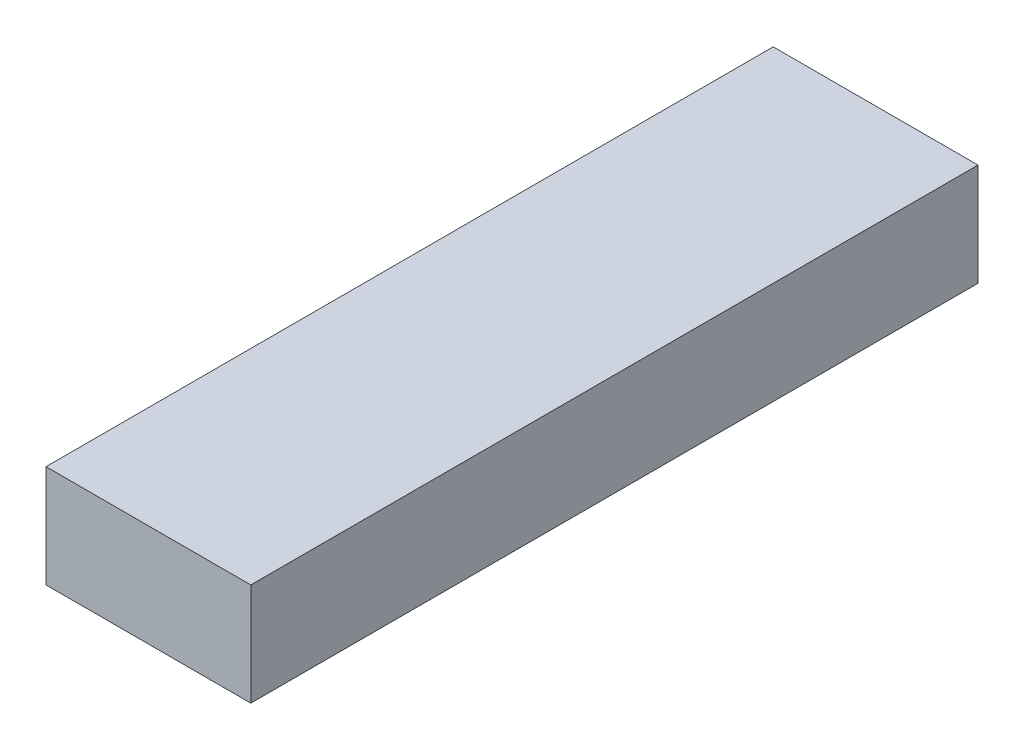
ISO-10303-21;
HEADER;
FILE_DESCRIPTION(('STEP AP214'),'2;1');
FILE_NAME('part.step','',(''),(''),'','','');
FILE_SCHEMA(('AUTOMOTIVE_DESIGN { 1 0 10303 214 1 1 1 1 }'));
ENDSEC;
DATA;
#1=APPLICATION_CONTEXT('core data for automotive mechanical design processes');
#2=APPLICATION_PROTOCOL_DEFINITION('international standard','automotive_design',2000,#1);
#3=PRODUCT_CONTEXT('',#1,'mechanical');
#4=PRODUCT('Part','Part','',(#3));
#5=PRODUCT_RELATED_PRODUCT_CATEGORY('part','',(#4));
#6=PRODUCT_DEFINITION_FORMATION('','',#4);
#7=PRODUCT_DEFINITION_CONTEXT('part definition',#1,'design');
#8=PRODUCT_DEFINITION('design','',#6,#7);
#9=PRODUCT_DEFINITION_SHAPE('','',#8);
#10=(LENGTH_UNIT() NAMED_UNIT(*) SI_UNIT(.MILLI.,.METRE.));
#11=(NAMED_UNIT(*) PLANE_ANGLE_UNIT() SI_UNIT($,.RADIAN.));
#12=(NAMED_UNIT(*) SI_UNIT($,.STERADIAN.) SOLID_ANGLE_UNIT());
#13=UNCERTAINTY_MEASURE_WITH_UNIT(LENGTH_MEASURE(1.E-05),#10,'distance_accuracy_value','');
#14=(GEOMETRIC_REPRESENTATION_CONTEXT(3) GLOBAL_UNCERTAINTY_ASSIGNED_CONTEXT((#13)) GLOBAL_UNIT_ASSIGNED_CONTEXT((#10,
#11,#12)) REPRESENTATION_CONTEXT('',''));
#15=CARTESIAN_POINT('',(0.,0.,0.));
#16=DIRECTION('',(0.,0.,1.));
#17=DIRECTION('',(1.,0.,0.));
#18=AXIS2_PLACEMENT_3D('',#15,#16,#17);
#19=CARTESIAN_POINT('',(50.8,25.4,360.775677228));
#20=DIRECTION('',(-1.,0.,0.));
#21=DIRECTION('',(0.,-1.,0.));
#22=AXIS2_PLACEMENT_3D('',#19,#20,#21);
#23=PLANE('',#22);
#24=DIRECTION('',(0.,1.,0.));
#25=VECTOR('',#24,1.);
#26=CARTESIAN_POINT('',(50.8,25.4,0.));
#27=LINE('',#26,#25);
#28=CARTESIAN_POINT('',(50.8,-25.4,0.));
#29=VERTEX_POINT('',#28);
#30=CARTESIAN_POINT('',(50.8,25.4,0.));
#31=VERTEX_POINT('',#30);
#32=EDGE_CURVE('E95',#29,#31,#27,.T.);
#33=ORIENTED_EDGE('',*,*,#32,.T.);
#34=DIRECTION('',(0.,0.,-1.));
#35=VECTOR('',#34,1.);
#36=CARTESIAN_POINT('',(50.8,25.4,360.775677228));
#37=LINE('',#36,#35);
#38=CARTESIAN_POINT('',(50.8,25.4,360.775677228));
#39=VERTEX_POINT('',#38);
#40=EDGE_CURVE('E11',#39,#31,#37,.T.);
#41=ORIENTED_EDGE('',*,*,#40,.F.);
#42=DIRECTION('',(0.,1.,0.));
#43=VECTOR('',#42,1.);
#44=CARTESIAN_POINT('',(50.8,25.4,360.775677228));
#45=LINE('',#44,#43);
#46=CARTESIAN_POINT('',(50.8,-25.4,360.775677228));
#47=VERTEX_POINT('',#46);
#48=EDGE_CURVE('E83',#47,#39,#45,.T.);
#49=ORIENTED_EDGE('',*,*,#48,.F.);
#50=DIRECTION('',(0.,0.,-1.));
#51=VECTOR('',#50,1.);
#52=CARTESIAN_POINT('',(50.8,-25.4,360.775677228));
#53=LINE('',#52,#51);
#54=EDGE_CURVE('E91',#47,#29,#53,.T.);
#55=ORIENTED_EDGE('',*,*,#54,.T.);
#56=EDGE_LOOP('',(#33,#41,#49,#55));
#57=FACE_BOUND('',#56,.T.);
#58=ADVANCED_FACE('F32',(#57),#23,.F.);
#59=CARTESIAN_POINT('',(-50.8,25.4,360.775677228));
#60=DIRECTION('',(0.,-1.,0.));
#61=DIRECTION('',(0.,0.,-1.));
#62=AXIS2_PLACEMENT_3D('',#59,#60,#61);
#63=PLANE('',#62);
#64=DIRECTION('',(-1.,0.,0.));
#65=VECTOR('',#64,1.);
#66=CARTESIAN_POINT('',(-50.8,25.4,0.));
#67=LINE('',#66,#65);
#68=CARTESIAN_POINT('',(-50.8,25.4,0.));
#69=VERTEX_POINT('',#68);
#70=EDGE_CURVE('E87',#31,#69,#67,.T.);
#71=ORIENTED_EDGE('',*,*,#70,.T.);
#72=DIRECTION('',(0.,0.,-1.));
#73=VECTOR('',#72,1.);
#74=CARTESIAN_POINT('',(-50.8,25.4,360.775677228));
#75=LINE('',#74,#73);
#76=CARTESIAN_POINT('',(-50.8,25.4,360.775677228));
#77=VERTEX_POINT('',#76);
#78=EDGE_CURVE('E40',#77,#69,#75,.T.);
#79=ORIENTED_EDGE('',*,*,#78,.F.);
#80=DIRECTION('',(-1.,0.,0.));
#81=VECTOR('',#80,1.);
#82=CARTESIAN_POINT('',(-50.8,25.4,360.775677228));
#83=LINE('',#82,#81);
#84=EDGE_CURVE('E78',#39,#77,#83,.T.);
#85=ORIENTED_EDGE('',*,*,#84,.F.);
#86=ORIENTED_EDGE('',*,*,#40,.T.);
#87=EDGE_LOOP('',(#71,#79,#85,#86));
#88=FACE_BOUND('',#87,.T.);
#89=ADVANCED_FACE('F86',(#88),#63,.F.);
#90=CARTESIAN_POINT('',(-50.8,25.4,360.775677228));
#91=DIRECTION('',(1.,0.,0.));
#92=DIRECTION('',(0.,1.,0.));
#93=AXIS2_PLACEMENT_3D('',#90,#91,#92);
#94=PLANE('',#93);
#95=DIRECTION('',(0.,-1.,0.));
#96=VECTOR('',#95,1.);
#97=CARTESIAN_POINT('',(-50.8,25.4,0.));
#98=LINE('',#97,#96);
#99=CARTESIAN_POINT('',(-50.8,-25.4,0.));
#100=VERTEX_POINT('',#99);
#101=EDGE_CURVE('E65',#69,#100,#98,.T.);
#102=ORIENTED_EDGE('',*,*,#101,.T.);
#103=DIRECTION('',(0.,0.,-1.));
#104=VECTOR('',#103,1.);
#105=CARTESIAN_POINT('',(-50.8,-25.4,360.775677228));
#106=LINE('',#105,#104);
#107=CARTESIAN_POINT('',(-50.8,-25.4,360.775677228));
#108=VERTEX_POINT('',#107);
#109=EDGE_CURVE('E88',#108,#100,#106,.T.);
#110=ORIENTED_EDGE('',*,*,#109,.F.);
#111=DIRECTION('',(0.,-1.,0.));
#112=VECTOR('',#111,1.);
#113=CARTESIAN_POINT('',(-50.8,25.4,360.775677228));
#114=LINE('',#113,#112);
#115=EDGE_CURVE('E81',#77,#108,#114,.T.);
#116=ORIENTED_EDGE('',*,*,#115,.F.);
#117=ORIENTED_EDGE('',*,*,#78,.T.);
#118=EDGE_LOOP('',(#102,#110,#116,#117));
#119=FACE_BOUND('',#118,.T.);
#120=ADVANCED_FACE('F89',(#119),#94,.F.);
#121=CARTESIAN_POINT('',(-50.8,-25.4,360.775677228));
#122=DIRECTION('',(0.,1.,0.));
#123=DIRECTION('',(0.,0.,1.));
#124=AXIS2_PLACEMENT_3D('',#121,#122,#123);
#125=PLANE('',#124);
#126=DIRECTION('',(1.,0.,0.));
#127=VECTOR('',#126,1.);
#128=CARTESIAN_POINT('',(-50.8,-25.4,0.));
#129=LINE('',#128,#127);
#130=EDGE_CURVE('E71',#100,#29,#129,.T.);
#131=ORIENTED_EDGE('',*,*,#130,.T.);
#132=ORIENTED_EDGE('',*,*,#54,.F.);
#133=DIRECTION('',(1.,0.,0.));
#134=VECTOR('',#133,1.);
#135=CARTESIAN_POINT('',(-50.8,-25.4,360.775677228));
#136=LINE('',#135,#134);
#137=EDGE_CURVE('E48',#108,#47,#136,.T.);
#138=ORIENTED_EDGE('',*,*,#137,.F.);
#139=ORIENTED_EDGE('',*,*,#109,.T.);
#140=EDGE_LOOP('',(#131,#132,#138,#139));
#141=FACE_BOUND('',#140,.T.);
#142=ADVANCED_FACE('F102',(#141),#125,.F.);
#143=CARTESIAN_POINT('',(0.,0.,360.775677228));
#144=DIRECTION('',(0.,0.,1.));
#145=DIRECTION('',(1.,0.,0.));
#146=AXIS2_PLACEMENT_3D('',#143,#144,#145);
#147=PLANE('',#146);
#148=ORIENTED_EDGE('',*,*,#48,.T.);
#149=ORIENTED_EDGE('',*,*,#84,.T.);
#150=ORIENTED_EDGE('',*,*,#115,.T.);
#151=ORIENTED_EDGE('',*,*,#137,.T.);
#152=EDGE_LOOP('',(#148,#149,#150,#151));
#153=FACE_BOUND('',#152,.T.);
#154=ADVANCED_FACE('F79',(#153),#147,.T.);
#155=CARTESIAN_POINT('',(0.,0.,0.));
#156=DIRECTION('',(0.,0.,1.));
#157=DIRECTION('',(1.,0.,0.));
#158=AXIS2_PLACEMENT_3D('',#155,#156,#157);
#159=PLANE('',#158);
#160=ORIENTED_EDGE('',*,*,#32,.F.);
#161=ORIENTED_EDGE('',*,*,#130,.F.);
#162=ORIENTED_EDGE('',*,*,#101,.F.);
#163=ORIENTED_EDGE('',*,*,#70,.F.);
#164=EDGE_LOOP('',(#160,#161,#162,#163));
#165=FACE_BOUND('',#164,.T.);
#166=ADVANCED_FACE('F105',(#165),#159,.F.);
#167=CLOSED_SHELL('',(#58,#89,#120,#142,#154,#166));
#168=MANIFOLD_SOLID_BREP('B2',#167);
#169=ADVANCED_BREP_SHAPE_REPRESENTATION('',(#18,#168),#14);
#170=SHAPE_DEFINITION_REPRESENTATION(#9,#169);
ENDSEC;
END-ISO-10303-21;
